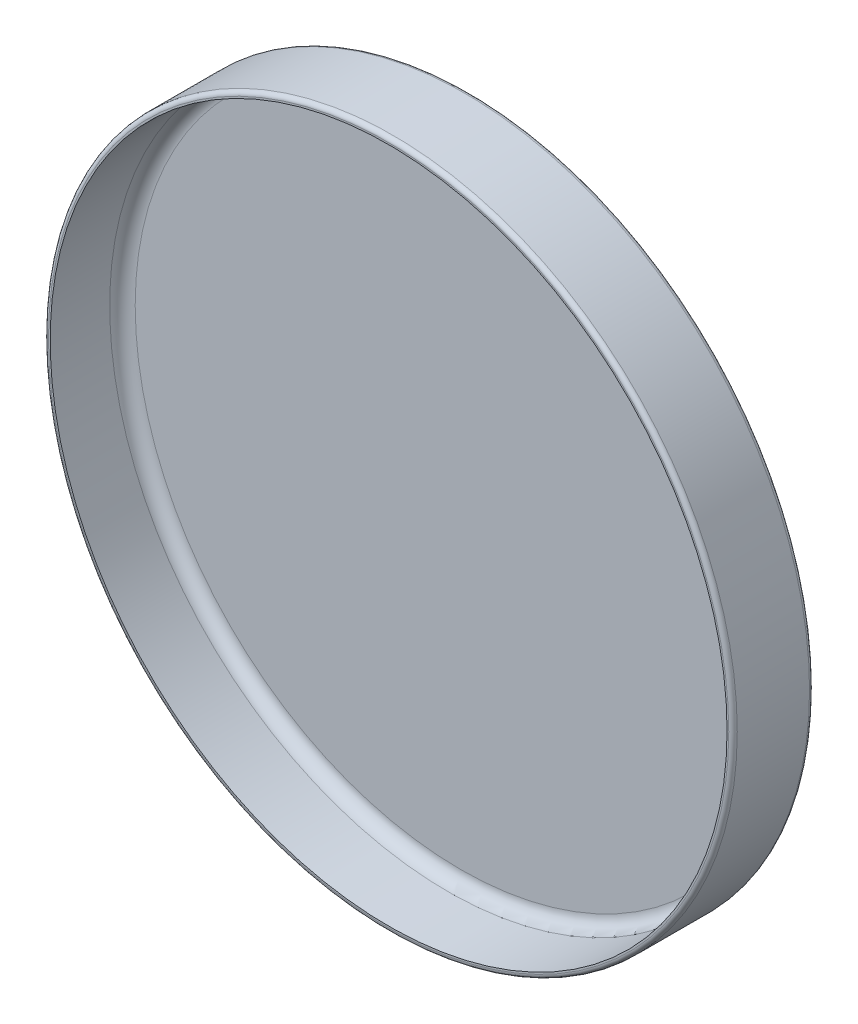
ISO-10303-21;
HEADER;
FILE_DESCRIPTION(('STEP AP214'),'2;1');
FILE_NAME('part.step','',(''),(''),'','','');
FILE_SCHEMA(('AUTOMOTIVE_DESIGN { 1 0 10303 214 1 1 1 1 }'));
ENDSEC;
DATA;
#1=APPLICATION_CONTEXT('core data for automotive mechanical design processes');
#2=APPLICATION_PROTOCOL_DEFINITION('international standard','automotive_design',2000,#1);
#3=PRODUCT_CONTEXT('',#1,'mechanical');
#4=PRODUCT('Part','Part','',(#3));
#5=PRODUCT_RELATED_PRODUCT_CATEGORY('part','',(#4));
#6=PRODUCT_DEFINITION_FORMATION('','',#4);
#7=PRODUCT_DEFINITION_CONTEXT('part definition',#1,'design');
#8=PRODUCT_DEFINITION('design','',#6,#7);
#9=PRODUCT_DEFINITION_SHAPE('','',#8);
#10=(LENGTH_UNIT() NAMED_UNIT(*) SI_UNIT(.MILLI.,.METRE.));
#11=(NAMED_UNIT(*) PLANE_ANGLE_UNIT() SI_UNIT($,.RADIAN.));
#12=(NAMED_UNIT(*) SI_UNIT($,.STERADIAN.) SOLID_ANGLE_UNIT());
#13=UNCERTAINTY_MEASURE_WITH_UNIT(LENGTH_MEASURE(1.E-05),#10,'distance_accuracy_value','');
#14=(GEOMETRIC_REPRESENTATION_CONTEXT(3) GLOBAL_UNCERTAINTY_ASSIGNED_CONTEXT((#13)) GLOBAL_UNIT_ASSIGNED_CONTEXT((#10,
#11,#12)) REPRESENTATION_CONTEXT('',''));
#15=CARTESIAN_POINT('',(0.,0.,0.));
#16=DIRECTION('',(0.,0.,1.));
#17=DIRECTION('',(1.,0.,0.));
#18=AXIS2_PLACEMENT_3D('',#15,#16,#17);
#19=CARTESIAN_POINT('',(0.,0.,-2.));
#20=DIRECTION('',(0.,0.,1.));
#21=DIRECTION('',(1.,0.,0.));
#22=AXIS2_PLACEMENT_3D('',#19,#20,#21);
#23=CYLINDRICAL_SURFACE('',#22,81.);
#24=CARTESIAN_POINT('',(0.,0.,16.));
#25=DIRECTION('',(0.,0.,1.));
#26=DIRECTION('',(1.,0.,0.));
#27=AXIS2_PLACEMENT_3D('',#24,#25,#26);
#28=CIRCLE('',#27,81.);
#29=CARTESIAN_POINT('',(81.,0.,16.));
#30=VERTEX_POINT('',#29);
#31=EDGE_CURVE('E44',#30,#30,#28,.F.);
#32=ORIENTED_EDGE('',*,*,#31,.T.);
#33=EDGE_LOOP('',(#32));
#34=FACE_BOUND('',#33,.T.);
#35=CARTESIAN_POINT('',(0.,0.,-1.));
#36=DIRECTION('',(0.,0.,1.));
#37=DIRECTION('',(1.,0.,0.));
#38=AXIS2_PLACEMENT_3D('',#35,#36,#37);
#39=CIRCLE('',#38,81.);
#40=CARTESIAN_POINT('',(81.,0.,-1.));
#41=VERTEX_POINT('',#40);
#42=EDGE_CURVE('E56',#41,#41,#39,.T.);
#43=ORIENTED_EDGE('',*,*,#42,.T.);
#44=EDGE_LOOP('',(#43));
#45=FACE_BOUND('',#44,.T.);
#46=ADVANCED_FACE('F33',(#34,#45),#23,.T.);
#47=CARTESIAN_POINT('',(0.,0.,-2.));
#48=DIRECTION('',(0.,0.,1.));
#49=DIRECTION('',(1.,0.,0.));
#50=AXIS2_PLACEMENT_3D('',#47,#48,#49);
#51=PLANE('',#50);
#52=CARTESIAN_POINT('',(0.,0.,-2.));
#53=DIRECTION('',(0.,0.,1.));
#54=DIRECTION('',(1.,0.,0.));
#55=AXIS2_PLACEMENT_3D('',#52,#53,#54);
#56=CIRCLE('',#55,80.);
#57=CARTESIAN_POINT('',(80.,0.,-2.));
#58=VERTEX_POINT('',#57);
#59=EDGE_CURVE('E53',#58,#58,#56,.F.);
#60=ORIENTED_EDGE('',*,*,#59,.T.);
#61=EDGE_LOOP('',(#60));
#62=FACE_BOUND('',#61,.T.);
#63=ADVANCED_FACE('F76',(#62),#51,.F.);
#64=CARTESIAN_POINT('',(0.,0.,17.));
#65=DIRECTION('',(0.,0.,-1.));
#66=DIRECTION('',(-1.,0.,0.));
#67=AXIS2_PLACEMENT_3D('',#64,#65,#66);
#68=CYLINDRICAL_SURFACE('',#67,79.6);
#69=CARTESIAN_POINT('',(0.,0.,3.));
#70=DIRECTION('',(0.,0.,1.));
#71=DIRECTION('',(1.,0.,0.));
#72=AXIS2_PLACEMENT_3D('',#69,#70,#71);
#73=CIRCLE('',#72,79.6);
#74=CARTESIAN_POINT('',(79.6,0.,3.));
#75=VERTEX_POINT('',#74);
#76=EDGE_CURVE('E40',#75,#75,#73,.F.);
#77=ORIENTED_EDGE('',*,*,#76,.T.);
#78=EDGE_LOOP('',(#77));
#79=FACE_BOUND('',#78,.T.);
#80=CARTESIAN_POINT('',(0.,0.,17.));
#81=DIRECTION('',(0.,0.,1.));
#82=DIRECTION('',(1.,0.,0.));
#83=AXIS2_PLACEMENT_3D('',#80,#81,#82);
#84=CIRCLE('',#83,79.6);
#85=CARTESIAN_POINT('',(79.6,0.,17.));
#86=VERTEX_POINT('',#85);
#87=EDGE_CURVE('E59',#86,#86,#84,.T.);
#88=ORIENTED_EDGE('',*,*,#87,.T.);
#89=EDGE_LOOP('',(#88));
#90=FACE_BOUND('',#89,.T.);
#91=ADVANCED_FACE('F63',(#79,#90),#68,.F.);
#92=CARTESIAN_POINT('',(0.,0.,17.));
#93=DIRECTION('',(0.,0.,1.));
#94=DIRECTION('',(1.,0.,0.));
#95=AXIS2_PLACEMENT_3D('',#92,#93,#94);
#96=PLANE('',#95);
#97=CARTESIAN_POINT('',(0.,0.,17.));
#98=DIRECTION('',(0.,0.,1.));
#99=DIRECTION('',(1.,0.,0.));
#100=AXIS2_PLACEMENT_3D('',#97,#98,#99);
#101=CIRCLE('',#100,80.);
#102=CARTESIAN_POINT('',(80.,0.,17.));
#103=VERTEX_POINT('',#102);
#104=EDGE_CURVE('E48',#103,#103,#101,.T.);
#105=ORIENTED_EDGE('',*,*,#104,.T.);
#106=EDGE_LOOP('',(#105));
#107=FACE_BOUND('',#106,.T.);
#108=ORIENTED_EDGE('',*,*,#87,.F.);
#109=EDGE_LOOP('',(#108));
#110=FACE_BOUND('',#109,.T.);
#111=ADVANCED_FACE('F65',(#107,#110),#96,.T.);
#112=CARTESIAN_POINT('',(0.,0.,0.));
#113=DIRECTION('',(0.,0.,1.));
#114=DIRECTION('',(1.,0.,0.));
#115=AXIS2_PLACEMENT_3D('',#112,#113,#114);
#116=PLANE('',#115);
#117=CARTESIAN_POINT('',(0.,0.,0.));
#118=DIRECTION('',(0.,0.,1.));
#119=DIRECTION('',(1.,0.,0.));
#120=AXIS2_PLACEMENT_3D('',#117,#118,#119);
#121=CIRCLE('',#120,76.6);
#122=CARTESIAN_POINT('',(76.6,0.,0.));
#123=VERTEX_POINT('',#122);
#124=EDGE_CURVE('E10',#123,#123,#121,.T.);
#125=ORIENTED_EDGE('',*,*,#124,.T.);
#126=EDGE_LOOP('',(#125));
#127=FACE_BOUND('',#126,.T.);
#128=ADVANCED_FACE('F67',(#127),#116,.T.);
#129=CARTESIAN_POINT('',(0.,0.,-1.));
#130=DIRECTION('',(0.,0.,1.));
#131=DIRECTION('',(1.,0.,0.));
#132=AXIS2_PLACEMENT_3D('',#129,#130,#131);
#133=TOROIDAL_SURFACE('',#132,80.,1.);
#134=ORIENTED_EDGE('',*,*,#59,.F.);
#135=EDGE_LOOP('',(#134));
#136=FACE_BOUND('',#135,.T.);
#137=ORIENTED_EDGE('',*,*,#42,.F.);
#138=EDGE_LOOP('',(#137));
#139=FACE_BOUND('',#138,.T.);
#140=ADVANCED_FACE('F74',(#136,#139),#133,.T.);
#141=CARTESIAN_POINT('',(0.,0.,16.));
#142=DIRECTION('',(0.,0.,1.));
#143=DIRECTION('',(1.,0.,0.));
#144=AXIS2_PLACEMENT_3D('',#141,#142,#143);
#145=TOROIDAL_SURFACE('',#144,80.,1.);
#146=ORIENTED_EDGE('',*,*,#31,.F.);
#147=EDGE_LOOP('',(#146));
#148=FACE_BOUND('',#147,.T.);
#149=ORIENTED_EDGE('',*,*,#104,.F.);
#150=EDGE_LOOP('',(#149));
#151=FACE_BOUND('',#150,.T.);
#152=ADVANCED_FACE('F89',(#148,#151),#145,.T.);
#153=CARTESIAN_POINT('',(0.,0.,3.));
#154=DIRECTION('',(0.,0.,1.));
#155=DIRECTION('',(1.,0.,0.));
#156=AXIS2_PLACEMENT_3D('',#153,#154,#155);
#157=TOROIDAL_SURFACE('',#156,76.6,3.);
#158=ORIENTED_EDGE('',*,*,#124,.F.);
#159=EDGE_LOOP('',(#158));
#160=FACE_BOUND('',#159,.T.);
#161=ORIENTED_EDGE('',*,*,#76,.F.);
#162=EDGE_LOOP('',(#161));
#163=FACE_BOUND('',#162,.T.);
#164=ADVANCED_FACE('F35',(#160,#163),#157,.F.);
#165=CLOSED_SHELL('',(#46,#63,#91,#111,#128,#140,#152,#164));
#166=MANIFOLD_SOLID_BREP('B2',#165);
#167=ADVANCED_BREP_SHAPE_REPRESENTATION('',(#18,#166),#14);
#168=SHAPE_DEFINITION_REPRESENTATION(#9,#167);
ENDSEC;
END-ISO-10303-21;
